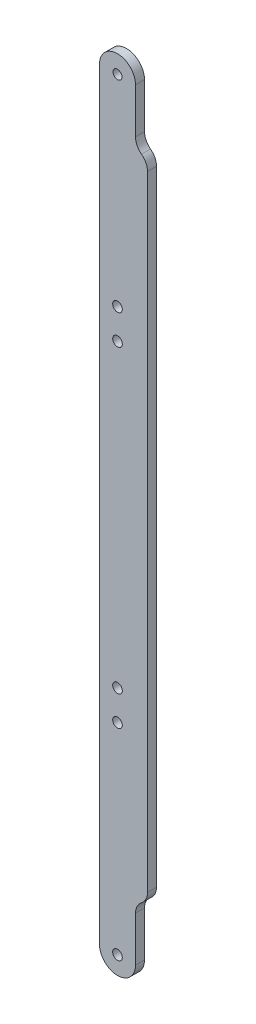
ISO-10303-21;
HEADER;
FILE_DESCRIPTION(('STEP AP214'),'2;1');
FILE_NAME('part.step','',(''),(''),'','','');
FILE_SCHEMA(('AUTOMOTIVE_DESIGN { 1 0 10303 214 1 1 1 1 }'));
ENDSEC;
DATA;
#1=APPLICATION_CONTEXT('core data for automotive mechanical design processes');
#2=APPLICATION_PROTOCOL_DEFINITION('international standard','automotive_design',2000,#1);
#3=PRODUCT_CONTEXT('',#1,'mechanical');
#4=PRODUCT('Part','Part','',(#3));
#5=PRODUCT_RELATED_PRODUCT_CATEGORY('part','',(#4));
#6=PRODUCT_DEFINITION_FORMATION('','',#4);
#7=PRODUCT_DEFINITION_CONTEXT('part definition',#1,'design');
#8=PRODUCT_DEFINITION('design','',#6,#7);
#9=PRODUCT_DEFINITION_SHAPE('','',#8);
#10=(LENGTH_UNIT() NAMED_UNIT(*) SI_UNIT(.MILLI.,.METRE.));
#11=(NAMED_UNIT(*) PLANE_ANGLE_UNIT() SI_UNIT($,.RADIAN.));
#12=(NAMED_UNIT(*) SI_UNIT($,.STERADIAN.) SOLID_ANGLE_UNIT());
#13=UNCERTAINTY_MEASURE_WITH_UNIT(LENGTH_MEASURE(1.E-05),#10,'distance_accuracy_value','');
#14=(GEOMETRIC_REPRESENTATION_CONTEXT(3) GLOBAL_UNCERTAINTY_ASSIGNED_CONTEXT((#13)) GLOBAL_UNIT_ASSIGNED_CONTEXT((#10,
#11,#12)) REPRESENTATION_CONTEXT('',''));
#15=CARTESIAN_POINT('',(0.,0.,0.));
#16=DIRECTION('',(0.,0.,1.));
#17=DIRECTION('',(1.,0.,0.));
#18=AXIS2_PLACEMENT_3D('',#15,#16,#17);
#19=CARTESIAN_POINT('',(0.,0.,3.));
#20=DIRECTION('',(0.,0.,-1.));
#21=DIRECTION('',(-1.,0.,0.));
#22=AXIS2_PLACEMENT_3D('',#19,#20,#21);
#23=PLANE('',#22);
#24=CARTESIAN_POINT('',(-9.99999999999977,-58.1088667947393,3.));
#25=DIRECTION('',(0.,0.,1.));
#26=DIRECTION('',(1.,0.,0.));
#27=AXIS2_PLACEMENT_3D('',#24,#25,#26);
#28=CIRCLE('',#27,1.6);
#29=CARTESIAN_POINT('',(-8.39999999999977,-58.1088667947393,3.));
#30=VERTEX_POINT('',#29);
#31=EDGE_CURVE('E150',#30,#30,#28,.T.);
#32=ORIENTED_EDGE('',*,*,#31,.F.);
#33=EDGE_LOOP('',(#32));
#34=FACE_BOUND('',#33,.T.);
#35=CARTESIAN_POINT('',(-9.99999999999976,-48.1088667947393,3.));
#36=DIRECTION('',(0.,0.,1.));
#37=DIRECTION('',(1.,0.,0.));
#38=AXIS2_PLACEMENT_3D('',#35,#36,#37);
#39=CIRCLE('',#38,1.6);
#40=CARTESIAN_POINT('',(-8.39999999999976,-48.1088667947393,3.));
#41=VERTEX_POINT('',#40);
#42=EDGE_CURVE('E144',#41,#41,#39,.T.);
#43=ORIENTED_EDGE('',*,*,#42,.F.);
#44=EDGE_LOOP('',(#43));
#45=FACE_BOUND('',#44,.T.);
#46=CARTESIAN_POINT('',(-9.99999999999947,51.8911332052607,3.));
#47=DIRECTION('',(0.,0.,1.));
#48=DIRECTION('',(1.,0.,0.));
#49=AXIS2_PLACEMENT_3D('',#46,#47,#48);
#50=CIRCLE('',#49,1.6);
#51=CARTESIAN_POINT('',(-8.39999999999947,51.8911332052607,3.));
#52=VERTEX_POINT('',#51);
#53=EDGE_CURVE('E138',#52,#52,#50,.T.);
#54=ORIENTED_EDGE('',*,*,#53,.F.);
#55=EDGE_LOOP('',(#54));
#56=FACE_BOUND('',#55,.T.);
#57=CARTESIAN_POINT('',(-9.99999999999946,61.8911332052607,3.));
#58=DIRECTION('',(0.,0.,1.));
#59=DIRECTION('',(1.,0.,0.));
#60=AXIS2_PLACEMENT_3D('',#57,#58,#59);
#61=CIRCLE('',#60,1.6);
#62=CARTESIAN_POINT('',(-8.39999999999946,61.8911332052607,3.));
#63=VERTEX_POINT('',#62);
#64=EDGE_CURVE('E131',#63,#63,#61,.T.);
#65=ORIENTED_EDGE('',*,*,#64,.F.);
#66=EDGE_LOOP('',(#65));
#67=FACE_BOUND('',#66,.T.);
#68=CARTESIAN_POINT('',(-9.99999999999999,-125.108866794739,3.));
#69=DIRECTION('',(0.,0.,1.));
#70=DIRECTION('',(1.,0.,0.));
#71=AXIS2_PLACEMENT_3D('',#68,#69,#70);
#72=CIRCLE('',#71,1.6);
#73=CARTESIAN_POINT('',(-8.39999999999999,-125.108866794739,3.));
#74=VERTEX_POINT('',#73);
#75=EDGE_CURVE('E121',#74,#74,#72,.T.);
#76=ORIENTED_EDGE('',*,*,#75,.F.);
#77=EDGE_LOOP('',(#76));
#78=FACE_BOUND('',#77,.T.);
#79=CARTESIAN_POINT('',(-9.99999999999994,128.891133205261,3.));
#80=DIRECTION('',(0.,0.,1.));
#81=DIRECTION('',(1.,0.,0.));
#82=AXIS2_PLACEMENT_3D('',#79,#80,#81);
#83=CIRCLE('',#82,1.5);
#84=CARTESIAN_POINT('',(-8.49999999999994,128.891133205261,3.));
#85=VERTEX_POINT('',#84);
#86=EDGE_CURVE('E125',#85,#85,#83,.F.);
#87=ORIENTED_EDGE('',*,*,#86,.T.);
#88=EDGE_LOOP('',(#87));
#89=FACE_BOUND('',#88,.T.);
#90=CARTESIAN_POINT('',(1.00000000000001,-110.108866794739,3.));
#91=DIRECTION('',(0.,0.,-1.));
#92=DIRECTION('',(-1.,0.,0.));
#93=AXIS2_PLACEMENT_3D('',#90,#91,#92);
#94=CIRCLE('',#93,5.);
#95=CARTESIAN_POINT('',(-3.99999999999999,-110.108866794739,3.));
#96=VERTEX_POINT('',#95);
#97=CARTESIAN_POINT('',(-1.99999999999999,-106.108866794739,3.));
#98=VERTEX_POINT('',#97);
#99=EDGE_CURVE('E108',#96,#98,#94,.T.);
#100=ORIENTED_EDGE('',*,*,#99,.T.);
#101=CARTESIAN_POINT('',(-4.99999999999999,-102.108866794739,3.));
#102=DIRECTION('',(0.,0.,-1.));
#103=DIRECTION('',(-1.,0.,0.));
#104=AXIS2_PLACEMENT_3D('',#101,#102,#103);
#105=CIRCLE('',#104,5.);
#106=CARTESIAN_POINT('',(0.,-102.108866794739,3.));
#107=VERTEX_POINT('',#106);
#108=EDGE_CURVE('E162',#98,#107,#105,.F.);
#109=ORIENTED_EDGE('',*,*,#108,.T.);
#110=DIRECTION('',(0.,1.,0.));
#111=VECTOR('',#110,1.);
#112=CARTESIAN_POINT('',(0.,-43.1088667947392,3.));
#113=LINE('',#112,#111);
#114=CARTESIAN_POINT('',(0.,105.891133205261,3.));
#115=VERTEX_POINT('',#114);
#116=EDGE_CURVE('E11',#107,#115,#113,.T.);
#117=ORIENTED_EDGE('',*,*,#116,.T.);
#118=CARTESIAN_POINT('',(-5.00000000000001,105.891133205261,3.));
#119=DIRECTION('',(0.,0.,-1.));
#120=DIRECTION('',(-1.,0.,0.));
#121=AXIS2_PLACEMENT_3D('',#118,#119,#120);
#122=CIRCLE('',#121,5.);
#123=CARTESIAN_POINT('',(-2.00000000000002,109.891133205261,3.));
#124=VERTEX_POINT('',#123);
#125=EDGE_CURVE('E113',#124,#115,#122,.T.);
#126=ORIENTED_EDGE('',*,*,#125,.F.);
#127=CARTESIAN_POINT('',(0.999999999999985,113.891133205261,3.));
#128=DIRECTION('',(0.,0.,-1.));
#129=DIRECTION('',(-1.,0.,0.));
#130=AXIS2_PLACEMENT_3D('',#127,#128,#129);
#131=CIRCLE('',#130,5.);
#132=CARTESIAN_POINT('',(-4.00000000000002,113.891133205261,3.));
#133=VERTEX_POINT('',#132);
#134=EDGE_CURVE('E135',#133,#124,#131,.F.);
#135=ORIENTED_EDGE('',*,*,#134,.F.);
#136=DIRECTION('',(0.,-1.,0.));
#137=VECTOR('',#136,1.);
#138=CARTESIAN_POINT('',(-3.99999999999999,0.,3.));
#139=LINE('',#138,#137);
#140=CARTESIAN_POINT('',(-4.00000000000002,128.891133205261,3.));
#141=VERTEX_POINT('',#140);
#142=EDGE_CURVE('E94',#141,#133,#139,.T.);
#143=ORIENTED_EDGE('',*,*,#142,.F.);
#144=CARTESIAN_POINT('',(-10.,128.891133205261,3.));
#145=DIRECTION('',(0.,0.,1.));
#146=DIRECTION('',(1.,0.,0.));
#147=AXIS2_PLACEMENT_3D('',#144,#145,#146);
#148=CIRCLE('',#147,6.);
#149=CARTESIAN_POINT('',(-16.,128.891133205261,3.));
#150=VERTEX_POINT('',#149);
#151=EDGE_CURVE('E112',#150,#141,#148,.F.);
#152=ORIENTED_EDGE('',*,*,#151,.F.);
#153=DIRECTION('',(0.,1.,0.));
#154=VECTOR('',#153,1.);
#155=CARTESIAN_POINT('',(-16.,0.,3.));
#156=LINE('',#155,#154);
#157=CARTESIAN_POINT('',(-16.,-125.108866794739,3.));
#158=VERTEX_POINT('',#157);
#159=EDGE_CURVE('E41',#158,#150,#156,.T.);
#160=ORIENTED_EDGE('',*,*,#159,.F.);
#161=CARTESIAN_POINT('',(-9.99999999999999,-125.108866794739,3.));
#162=DIRECTION('',(0.,0.,1.));
#163=DIRECTION('',(1.,0.,0.));
#164=AXIS2_PLACEMENT_3D('',#161,#162,#163);
#165=CIRCLE('',#164,6.);
#166=CARTESIAN_POINT('',(-3.99999999999999,-125.108866794739,3.));
#167=VERTEX_POINT('',#166);
#168=EDGE_CURVE('E93',#158,#167,#165,.T.);
#169=ORIENTED_EDGE('',*,*,#168,.T.);
#170=DIRECTION('',(0.,1.,0.));
#171=VECTOR('',#170,1.);
#172=CARTESIAN_POINT('',(-3.99999999999999,0.,3.));
#173=LINE('',#172,#171);
#174=EDGE_CURVE('E81',#167,#96,#173,.T.);
#175=ORIENTED_EDGE('',*,*,#174,.T.);
#176=EDGE_LOOP('',(#100,#109,#117,#126,#135,#143,#152,#160,#169,#175));
#177=FACE_BOUND('',#176,.T.);
#178=ADVANCED_FACE('F37',(#34,#45,#56,#67,#78,#89,#177),#23,.F.);
#179=CARTESIAN_POINT('',(0.,0.,0.));
#180=DIRECTION('',(0.,0.,-1.));
#181=DIRECTION('',(-1.,0.,0.));
#182=AXIS2_PLACEMENT_3D('',#179,#180,#181);
#183=PLANE('',#182);
#184=CARTESIAN_POINT('',(-9.99999999999994,128.891133205261,0.));
#185=DIRECTION('',(0.,0.,1.));
#186=DIRECTION('',(1.,0.,0.));
#187=AXIS2_PLACEMENT_3D('',#184,#185,#186);
#188=CIRCLE('',#187,1.5);
#189=CARTESIAN_POINT('',(-8.49999999999994,128.891133205261,0.));
#190=VERTEX_POINT('',#189);
#191=EDGE_CURVE('E122',#190,#190,#188,.F.);
#192=ORIENTED_EDGE('',*,*,#191,.F.);
#193=EDGE_LOOP('',(#192));
#194=FACE_BOUND('',#193,.T.);
#195=CARTESIAN_POINT('',(-9.99999999999999,-125.108866794739,0.));
#196=DIRECTION('',(0.,0.,1.));
#197=DIRECTION('',(1.,0.,0.));
#198=AXIS2_PLACEMENT_3D('',#195,#196,#197);
#199=CIRCLE('',#198,1.6);
#200=CARTESIAN_POINT('',(-8.39999999999999,-125.108866794739,0.));
#201=VERTEX_POINT('',#200);
#202=EDGE_CURVE('E118',#201,#201,#199,.T.);
#203=ORIENTED_EDGE('',*,*,#202,.T.);
#204=EDGE_LOOP('',(#203));
#205=FACE_BOUND('',#204,.T.);
#206=CARTESIAN_POINT('',(-9.99999999999946,61.8911332052607,0.));
#207=DIRECTION('',(0.,0.,1.));
#208=DIRECTION('',(1.,0.,0.));
#209=AXIS2_PLACEMENT_3D('',#206,#207,#208);
#210=CIRCLE('',#209,1.6);
#211=CARTESIAN_POINT('',(-8.39999999999946,61.8911332052607,0.));
#212=VERTEX_POINT('',#211);
#213=EDGE_CURVE('E134',#212,#212,#210,.T.);
#214=ORIENTED_EDGE('',*,*,#213,.T.);
#215=EDGE_LOOP('',(#214));
#216=FACE_BOUND('',#215,.T.);
#217=CARTESIAN_POINT('',(-9.99999999999947,51.8911332052607,0.));
#218=DIRECTION('',(0.,0.,1.));
#219=DIRECTION('',(1.,0.,0.));
#220=AXIS2_PLACEMENT_3D('',#217,#218,#219);
#221=CIRCLE('',#220,1.6);
#222=CARTESIAN_POINT('',(-8.39999999999947,51.8911332052607,0.));
#223=VERTEX_POINT('',#222);
#224=EDGE_CURVE('E141',#223,#223,#221,.T.);
#225=ORIENTED_EDGE('',*,*,#224,.T.);
#226=EDGE_LOOP('',(#225));
#227=FACE_BOUND('',#226,.T.);
#228=CARTESIAN_POINT('',(-9.99999999999976,-48.1088667947393,0.));
#229=DIRECTION('',(0.,0.,1.));
#230=DIRECTION('',(1.,0.,0.));
#231=AXIS2_PLACEMENT_3D('',#228,#229,#230);
#232=CIRCLE('',#231,1.6);
#233=CARTESIAN_POINT('',(-8.39999999999976,-48.1088667947393,0.));
#234=VERTEX_POINT('',#233);
#235=EDGE_CURVE('E147',#234,#234,#232,.T.);
#236=ORIENTED_EDGE('',*,*,#235,.T.);
#237=EDGE_LOOP('',(#236));
#238=FACE_BOUND('',#237,.T.);
#239=CARTESIAN_POINT('',(-9.99999999999977,-58.1088667947393,0.));
#240=DIRECTION('',(0.,0.,1.));
#241=DIRECTION('',(1.,0.,0.));
#242=AXIS2_PLACEMENT_3D('',#239,#240,#241);
#243=CIRCLE('',#242,1.6);
#244=CARTESIAN_POINT('',(-8.39999999999977,-58.1088667947393,0.));
#245=VERTEX_POINT('',#244);
#246=EDGE_CURVE('E128',#245,#245,#243,.T.);
#247=ORIENTED_EDGE('',*,*,#246,.T.);
#248=EDGE_LOOP('',(#247));
#249=FACE_BOUND('',#248,.T.);
#250=CARTESIAN_POINT('',(-4.99999999999999,-102.108866794739,0.));
#251=DIRECTION('',(0.,0.,1.));
#252=DIRECTION('',(1.,0.,0.));
#253=AXIS2_PLACEMENT_3D('',#250,#251,#252);
#254=CIRCLE('',#253,5.);
#255=CARTESIAN_POINT('',(-1.99999999999999,-106.108866794739,0.));
#256=VERTEX_POINT('',#255);
#257=CARTESIAN_POINT('',(0.,-102.108866794739,0.));
#258=VERTEX_POINT('',#257);
#259=EDGE_CURVE('E56',#256,#258,#254,.T.);
#260=ORIENTED_EDGE('',*,*,#259,.F.);
#261=CARTESIAN_POINT('',(1.00000000000001,-110.108866794739,0.));
#262=DIRECTION('',(0.,0.,1.));
#263=DIRECTION('',(1.,0.,0.));
#264=AXIS2_PLACEMENT_3D('',#261,#262,#263);
#265=CIRCLE('',#264,5.);
#266=CARTESIAN_POINT('',(-3.99999999999999,-110.108866794739,0.));
#267=VERTEX_POINT('',#266);
#268=EDGE_CURVE('E194',#267,#256,#265,.F.);
#269=ORIENTED_EDGE('',*,*,#268,.F.);
#270=DIRECTION('',(0.,1.,0.));
#271=VECTOR('',#270,1.);
#272=CARTESIAN_POINT('',(-3.99999999999999,0.,0.));
#273=LINE('',#272,#271);
#274=CARTESIAN_POINT('',(-3.99999999999999,-125.108866794739,0.));
#275=VERTEX_POINT('',#274);
#276=EDGE_CURVE('E192',#275,#267,#273,.T.);
#277=ORIENTED_EDGE('',*,*,#276,.F.);
#278=CARTESIAN_POINT('',(-9.99999999999999,-125.108866794739,0.));
#279=DIRECTION('',(0.,0.,1.));
#280=DIRECTION('',(1.,0.,0.));
#281=AXIS2_PLACEMENT_3D('',#278,#279,#280);
#282=CIRCLE('',#281,6.);
#283=CARTESIAN_POINT('',(-16.,-125.108866794739,0.));
#284=VERTEX_POINT('',#283);
#285=EDGE_CURVE('E102',#284,#275,#282,.T.);
#286=ORIENTED_EDGE('',*,*,#285,.F.);
#287=DIRECTION('',(0.,1.,0.));
#288=VECTOR('',#287,1.);
#289=CARTESIAN_POINT('',(-16.,0.,0.));
#290=LINE('',#289,#288);
#291=CARTESIAN_POINT('',(-16.,128.891133205261,0.));
#292=VERTEX_POINT('',#291);
#293=EDGE_CURVE('E210',#284,#292,#290,.T.);
#294=ORIENTED_EDGE('',*,*,#293,.T.);
#295=CARTESIAN_POINT('',(-10.,128.891133205261,0.));
#296=DIRECTION('',(0.,0.,1.));
#297=DIRECTION('',(1.,0.,0.));
#298=AXIS2_PLACEMENT_3D('',#295,#296,#297);
#299=CIRCLE('',#298,6.);
#300=CARTESIAN_POINT('',(-4.00000000000002,128.891133205261,0.));
#301=VERTEX_POINT('',#300);
#302=EDGE_CURVE('E207',#292,#301,#299,.F.);
#303=ORIENTED_EDGE('',*,*,#302,.T.);
#304=DIRECTION('',(0.,-1.,0.));
#305=VECTOR('',#304,1.);
#306=CARTESIAN_POINT('',(-3.99999999999999,0.,0.));
#307=LINE('',#306,#305);
#308=CARTESIAN_POINT('',(-4.00000000000002,113.891133205261,0.));
#309=VERTEX_POINT('',#308);
#310=EDGE_CURVE('E204',#301,#309,#307,.T.);
#311=ORIENTED_EDGE('',*,*,#310,.T.);
#312=CARTESIAN_POINT('',(0.999999999999985,113.891133205261,0.));
#313=DIRECTION('',(0.,0.,1.));
#314=DIRECTION('',(1.,0.,0.));
#315=AXIS2_PLACEMENT_3D('',#312,#313,#314);
#316=CIRCLE('',#315,5.);
#317=CARTESIAN_POINT('',(-2.00000000000002,109.891133205261,0.));
#318=VERTEX_POINT('',#317);
#319=EDGE_CURVE('E201',#309,#318,#316,.T.);
#320=ORIENTED_EDGE('',*,*,#319,.T.);
#321=CARTESIAN_POINT('',(-5.00000000000001,105.891133205261,0.));
#322=DIRECTION('',(0.,0.,1.));
#323=DIRECTION('',(1.,0.,0.));
#324=AXIS2_PLACEMENT_3D('',#321,#322,#323);
#325=CIRCLE('',#324,5.);
#326=CARTESIAN_POINT('',(0.,105.891133205261,0.));
#327=VERTEX_POINT('',#326);
#328=EDGE_CURVE('E198',#318,#327,#325,.F.);
#329=ORIENTED_EDGE('',*,*,#328,.T.);
#330=DIRECTION('',(0.,1.,0.));
#331=VECTOR('',#330,1.);
#332=CARTESIAN_POINT('',(0.,-43.1088667947392,0.));
#333=LINE('',#332,#331);
#334=EDGE_CURVE('E47',#258,#327,#333,.T.);
#335=ORIENTED_EDGE('',*,*,#334,.F.);
#336=EDGE_LOOP('',(#260,#269,#277,#286,#294,#303,#311,#320,#329,#335));
#337=FACE_BOUND('',#336,.T.);
#338=ADVANCED_FACE('F214',(#194,#205,#216,#227,#238,#249,#337),#183,.T.);
#339=CARTESIAN_POINT('',(0.,-43.1088667947392,3.));
#340=DIRECTION('',(-1.,0.,0.));
#341=DIRECTION('',(0.,-1.,0.));
#342=AXIS2_PLACEMENT_3D('',#339,#340,#341);
#343=PLANE('',#342);
#344=DIRECTION('',(0.,0.,1.));
#345=VECTOR('',#344,1.);
#346=CARTESIAN_POINT('',(0.,105.891133205261,0.));
#347=LINE('',#346,#345);
#348=EDGE_CURVE('E170',#327,#115,#347,.T.);
#349=ORIENTED_EDGE('',*,*,#348,.T.);
#350=ORIENTED_EDGE('',*,*,#116,.F.);
#351=DIRECTION('',(0.,0.,1.));
#352=VECTOR('',#351,1.);
#353=CARTESIAN_POINT('',(0.,-102.108866794739,0.));
#354=LINE('',#353,#352);
#355=EDGE_CURVE('E173',#258,#107,#354,.T.);
#356=ORIENTED_EDGE('',*,*,#355,.F.);
#357=ORIENTED_EDGE('',*,*,#334,.T.);
#358=EDGE_LOOP('',(#349,#350,#356,#357));
#359=FACE_BOUND('',#358,.T.);
#360=ADVANCED_FACE('F39',(#359),#343,.F.);
#361=CARTESIAN_POINT('',(-9.99999999999999,-125.108866794739,3.));
#362=DIRECTION('',(0.,0.,-1.));
#363=DIRECTION('',(-1.,0.,0.));
#364=AXIS2_PLACEMENT_3D('',#361,#362,#363);
#365=CYLINDRICAL_SURFACE('',#364,1.6);
#366=ORIENTED_EDGE('',*,*,#75,.T.);
#367=EDGE_LOOP('',(#366));
#368=FACE_BOUND('',#367,.T.);
#369=ORIENTED_EDGE('',*,*,#202,.F.);
#370=EDGE_LOOP('',(#369));
#371=FACE_BOUND('',#370,.T.);
#372=ADVANCED_FACE('F282',(#368,#371),#365,.F.);
#373=CARTESIAN_POINT('',(-9.99999999999994,128.891133205261,0.));
#374=DIRECTION('',(0.,0.,1.));
#375=DIRECTION('',(1.,0.,0.));
#376=AXIS2_PLACEMENT_3D('',#373,#374,#375);
#377=CYLINDRICAL_SURFACE('',#376,1.5);
#378=ORIENTED_EDGE('',*,*,#191,.T.);
#379=EDGE_LOOP('',(#378));
#380=FACE_BOUND('',#379,.T.);
#381=ORIENTED_EDGE('',*,*,#86,.F.);
#382=EDGE_LOOP('',(#381));
#383=FACE_BOUND('',#382,.T.);
#384=ADVANCED_FACE('F284',(#380,#383),#377,.F.);
#385=CARTESIAN_POINT('',(-9.99999999999946,61.8911332052607,0.));
#386=DIRECTION('',(0.,0.,1.));
#387=DIRECTION('',(1.,0.,0.));
#388=AXIS2_PLACEMENT_3D('',#385,#386,#387);
#389=CYLINDRICAL_SURFACE('',#388,1.6);
#390=ORIENTED_EDGE('',*,*,#213,.F.);
#391=EDGE_LOOP('',(#390));
#392=FACE_BOUND('',#391,.T.);
#393=ORIENTED_EDGE('',*,*,#64,.T.);
#394=EDGE_LOOP('',(#393));
#395=FACE_BOUND('',#394,.T.);
#396=ADVANCED_FACE('F288',(#392,#395),#389,.F.);
#397=CARTESIAN_POINT('',(-9.99999999999947,51.8911332052607,0.));
#398=DIRECTION('',(0.,0.,1.));
#399=DIRECTION('',(1.,0.,0.));
#400=AXIS2_PLACEMENT_3D('',#397,#398,#399);
#401=CYLINDRICAL_SURFACE('',#400,1.6);
#402=ORIENTED_EDGE('',*,*,#224,.F.);
#403=EDGE_LOOP('',(#402));
#404=FACE_BOUND('',#403,.T.);
#405=ORIENTED_EDGE('',*,*,#53,.T.);
#406=EDGE_LOOP('',(#405));
#407=FACE_BOUND('',#406,.T.);
#408=ADVANCED_FACE('F292',(#404,#407),#401,.F.);
#409=CARTESIAN_POINT('',(-9.99999999999976,-48.1088667947393,0.));
#410=DIRECTION('',(0.,0.,1.));
#411=DIRECTION('',(1.,0.,0.));
#412=AXIS2_PLACEMENT_3D('',#409,#410,#411);
#413=CYLINDRICAL_SURFACE('',#412,1.6);
#414=ORIENTED_EDGE('',*,*,#235,.F.);
#415=EDGE_LOOP('',(#414));
#416=FACE_BOUND('',#415,.T.);
#417=ORIENTED_EDGE('',*,*,#42,.T.);
#418=EDGE_LOOP('',(#417));
#419=FACE_BOUND('',#418,.T.);
#420=ADVANCED_FACE('F296',(#416,#419),#413,.F.);
#421=CARTESIAN_POINT('',(-9.99999999999977,-58.1088667947393,0.));
#422=DIRECTION('',(0.,0.,1.));
#423=DIRECTION('',(1.,0.,0.));
#424=AXIS2_PLACEMENT_3D('',#421,#422,#423);
#425=CYLINDRICAL_SURFACE('',#424,1.6);
#426=ORIENTED_EDGE('',*,*,#246,.F.);
#427=EDGE_LOOP('',(#426));
#428=FACE_BOUND('',#427,.T.);
#429=ORIENTED_EDGE('',*,*,#31,.T.);
#430=EDGE_LOOP('',(#429));
#431=FACE_BOUND('',#430,.T.);
#432=ADVANCED_FACE('F268',(#428,#431),#425,.F.);
#433=CARTESIAN_POINT('',(0.999999999999985,113.891133205261,3.000012));
#434=DIRECTION('',(0.,0.,-1.));
#435=DIRECTION('',(-1.,0.,0.));
#436=AXIS2_PLACEMENT_3D('',#433,#434,#435);
#437=CYLINDRICAL_SURFACE('',#436,5.);
#438=ORIENTED_EDGE('',*,*,#134,.T.);
#439=DIRECTION('',(0.,0.,-1.));
#440=VECTOR('',#439,1.);
#441=CARTESIAN_POINT('',(-2.00000000000002,109.891133205261,3.000012));
#442=LINE('',#441,#440);
#443=EDGE_CURVE('E167',#124,#318,#442,.T.);
#444=ORIENTED_EDGE('',*,*,#443,.T.);
#445=ORIENTED_EDGE('',*,*,#319,.F.);
#446=DIRECTION('',(0.,0.,1.));
#447=VECTOR('',#446,1.);
#448=CARTESIAN_POINT('',(-4.00000000000002,113.891133205261,0.));
#449=LINE('',#448,#447);
#450=EDGE_CURVE('E174',#309,#133,#449,.T.);
#451=ORIENTED_EDGE('',*,*,#450,.T.);
#452=EDGE_LOOP('',(#438,#444,#445,#451));
#453=FACE_BOUND('',#452,.T.);
#454=ADVANCED_FACE('F251',(#453),#437,.F.);
#455=CARTESIAN_POINT('',(1.00000000000001,-110.108866794739,3.000012));
#456=DIRECTION('',(0.,0.,-1.));
#457=DIRECTION('',(-1.,0.,0.));
#458=AXIS2_PLACEMENT_3D('',#455,#456,#457);
#459=CYLINDRICAL_SURFACE('',#458,5.);
#460=DIRECTION('',(0.,0.,1.));
#461=VECTOR('',#460,1.);
#462=CARTESIAN_POINT('',(-3.99999999999999,-110.108866794739,0.));
#463=LINE('',#462,#461);
#464=EDGE_CURVE('E89',#267,#96,#463,.T.);
#465=ORIENTED_EDGE('',*,*,#464,.F.);
#466=ORIENTED_EDGE('',*,*,#268,.T.);
#467=DIRECTION('',(0.,0.,-1.));
#468=VECTOR('',#467,1.);
#469=CARTESIAN_POINT('',(-1.99999999999999,-106.108866794739,3.000012));
#470=LINE('',#469,#468);
#471=EDGE_CURVE('E180',#98,#256,#470,.T.);
#472=ORIENTED_EDGE('',*,*,#471,.F.);
#473=ORIENTED_EDGE('',*,*,#99,.F.);
#474=EDGE_LOOP('',(#465,#466,#472,#473));
#475=FACE_BOUND('',#474,.T.);
#476=ADVANCED_FACE('F260',(#475),#459,.F.);
#477=CARTESIAN_POINT('',(-16.,0.,0.));
#478=DIRECTION('',(1.,0.,0.));
#479=DIRECTION('',(0.,1.,0.));
#480=AXIS2_PLACEMENT_3D('',#477,#478,#479);
#481=PLANE('',#480);
#482=DIRECTION('',(0.,0.,1.));
#483=VECTOR('',#482,1.);
#484=CARTESIAN_POINT('',(-16.,128.891133205261,0.));
#485=LINE('',#484,#483);
#486=EDGE_CURVE('E188',#292,#150,#485,.T.);
#487=ORIENTED_EDGE('',*,*,#486,.F.);
#488=ORIENTED_EDGE('',*,*,#293,.F.);
#489=DIRECTION('',(0.,0.,1.));
#490=VECTOR('',#489,1.);
#491=CARTESIAN_POINT('',(-16.,-125.108866794739,0.));
#492=LINE('',#491,#490);
#493=EDGE_CURVE('E103',#284,#158,#492,.T.);
#494=ORIENTED_EDGE('',*,*,#493,.T.);
#495=ORIENTED_EDGE('',*,*,#159,.T.);
#496=EDGE_LOOP('',(#487,#488,#494,#495));
#497=FACE_BOUND('',#496,.T.);
#498=ADVANCED_FACE('F221',(#497),#481,.F.);
#499=CARTESIAN_POINT('',(-9.99999999999999,-125.108866794739,0.));
#500=DIRECTION('',(0.,0.,1.));
#501=DIRECTION('',(1.,0.,0.));
#502=AXIS2_PLACEMENT_3D('',#499,#500,#501);
#503=CYLINDRICAL_SURFACE('',#502,6.);
#504=ORIENTED_EDGE('',*,*,#168,.F.);
#505=ORIENTED_EDGE('',*,*,#493,.F.);
#506=ORIENTED_EDGE('',*,*,#285,.T.);
#507=DIRECTION('',(0.,0.,1.));
#508=VECTOR('',#507,1.);
#509=CARTESIAN_POINT('',(-3.99999999999999,-125.108866794739,0.));
#510=LINE('',#509,#508);
#511=EDGE_CURVE('E86',#275,#167,#510,.T.);
#512=ORIENTED_EDGE('',*,*,#511,.T.);
#513=EDGE_LOOP('',(#504,#505,#506,#512));
#514=FACE_BOUND('',#513,.T.);
#515=ADVANCED_FACE('F98',(#514),#503,.T.);
#516=CARTESIAN_POINT('',(-3.99999999999999,0.,0.));
#517=DIRECTION('',(1.,0.,0.));
#518=DIRECTION('',(0.,0.,-1.));
#519=AXIS2_PLACEMENT_3D('',#516,#517,#518);
#520=PLANE('',#519);
#521=ORIENTED_EDGE('',*,*,#174,.F.);
#522=ORIENTED_EDGE('',*,*,#511,.F.);
#523=ORIENTED_EDGE('',*,*,#276,.T.);
#524=ORIENTED_EDGE('',*,*,#464,.T.);
#525=EDGE_LOOP('',(#521,#522,#523,#524));
#526=FACE_BOUND('',#525,.T.);
#527=ADVANCED_FACE('F83',(#526),#520,.T.);
#528=CARTESIAN_POINT('',(-3.99999999999999,0.,0.));
#529=DIRECTION('',(-1.,0.,0.));
#530=DIRECTION('',(0.,-1.,0.));
#531=AXIS2_PLACEMENT_3D('',#528,#529,#530);
#532=PLANE('',#531);
#533=ORIENTED_EDGE('',*,*,#450,.F.);
#534=ORIENTED_EDGE('',*,*,#310,.F.);
#535=DIRECTION('',(0.,0.,1.));
#536=VECTOR('',#535,1.);
#537=CARTESIAN_POINT('',(-4.00000000000002,128.891133205261,0.));
#538=LINE('',#537,#536);
#539=EDGE_CURVE('E185',#301,#141,#538,.T.);
#540=ORIENTED_EDGE('',*,*,#539,.T.);
#541=ORIENTED_EDGE('',*,*,#142,.T.);
#542=EDGE_LOOP('',(#533,#534,#540,#541));
#543=FACE_BOUND('',#542,.T.);
#544=ADVANCED_FACE('F319',(#543),#532,.F.);
#545=CARTESIAN_POINT('',(-10.,128.891133205261,0.));
#546=DIRECTION('',(0.,0.,1.));
#547=DIRECTION('',(1.,0.,0.));
#548=AXIS2_PLACEMENT_3D('',#545,#546,#547);
#549=CYLINDRICAL_SURFACE('',#548,6.);
#550=ORIENTED_EDGE('',*,*,#539,.F.);
#551=ORIENTED_EDGE('',*,*,#302,.F.);
#552=ORIENTED_EDGE('',*,*,#486,.T.);
#553=ORIENTED_EDGE('',*,*,#151,.T.);
#554=EDGE_LOOP('',(#550,#551,#552,#553));
#555=FACE_BOUND('',#554,.T.);
#556=ADVANCED_FACE('F305',(#555),#549,.T.);
#557=CARTESIAN_POINT('',(-5.00000000000001,105.891133205261,3.000012));
#558=DIRECTION('',(0.,0.,-1.));
#559=DIRECTION('',(-1.,0.,0.));
#560=AXIS2_PLACEMENT_3D('',#557,#558,#559);
#561=CYLINDRICAL_SURFACE('',#560,5.);
#562=ORIENTED_EDGE('',*,*,#125,.T.);
#563=ORIENTED_EDGE('',*,*,#348,.F.);
#564=ORIENTED_EDGE('',*,*,#328,.F.);
#565=ORIENTED_EDGE('',*,*,#443,.F.);
#566=EDGE_LOOP('',(#562,#563,#564,#565));
#567=FACE_BOUND('',#566,.T.);
#568=ADVANCED_FACE('F241',(#567),#561,.T.);
#569=CARTESIAN_POINT('',(-4.99999999999999,-102.108866794739,3.000012));
#570=DIRECTION('',(0.,0.,-1.));
#571=DIRECTION('',(-1.,0.,0.));
#572=AXIS2_PLACEMENT_3D('',#569,#570,#571);
#573=CYLINDRICAL_SURFACE('',#572,5.);
#574=ORIENTED_EDGE('',*,*,#471,.T.);
#575=ORIENTED_EDGE('',*,*,#259,.T.);
#576=ORIENTED_EDGE('',*,*,#355,.T.);
#577=ORIENTED_EDGE('',*,*,#108,.F.);
#578=EDGE_LOOP('',(#574,#575,#576,#577));
#579=FACE_BOUND('',#578,.T.);
#580=ADVANCED_FACE('F230',(#579),#573,.T.);
#581=CLOSED_SHELL('',(#178,#338,#360,#372,#384,#396,#408,#420,#432,#454,#476,#498,#515,#527,
#544,#556,#568,#580));
#582=MANIFOLD_SOLID_BREP('B2',#581);
#583=ADVANCED_BREP_SHAPE_REPRESENTATION('',(#18,#582),#14);
#584=SHAPE_DEFINITION_REPRESENTATION(#9,#583);
ENDSEC;
END-ISO-10303-21;
